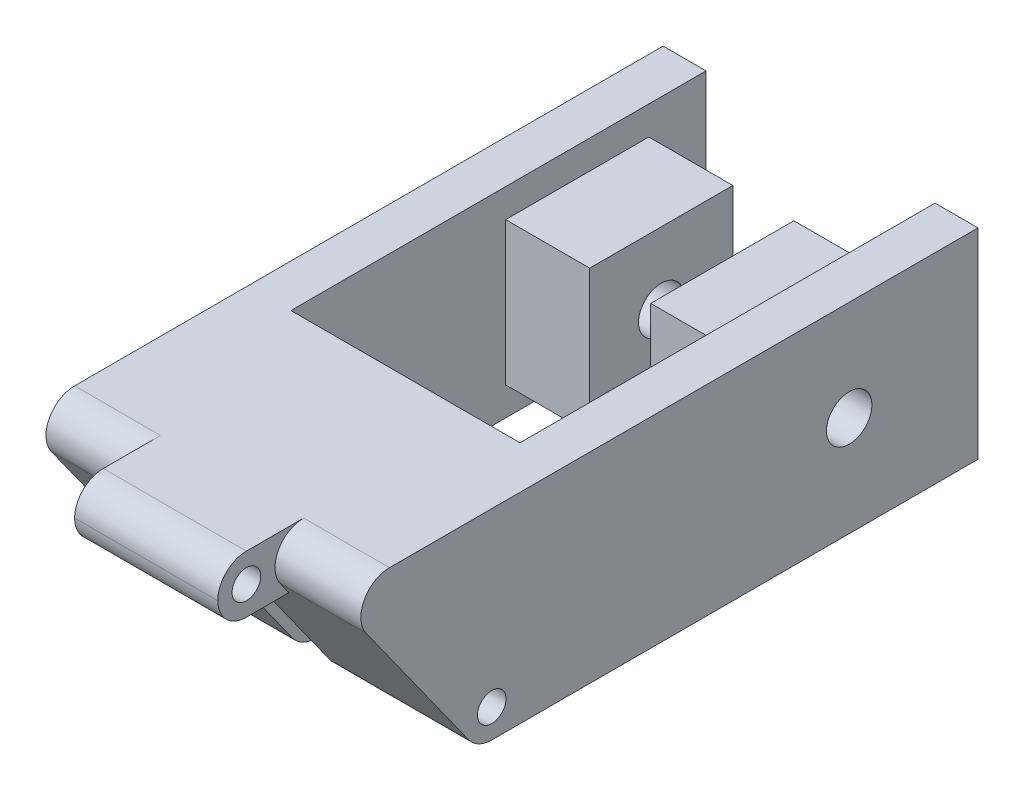
ISO-10303-21;
HEADER;
FILE_DESCRIPTION(('STEP AP214'),'2;1');
FILE_NAME('part.step','',(''),(''),'','','');
FILE_SCHEMA(('AUTOMOTIVE_DESIGN { 1 0 10303 214 1 1 1 1 }'));
ENDSEC;
DATA;
#1=APPLICATION_CONTEXT('core data for automotive mechanical design processes');
#2=APPLICATION_PROTOCOL_DEFINITION('international standard','automotive_design',2000,#1);
#3=PRODUCT_CONTEXT('',#1,'mechanical');
#4=PRODUCT('Part','Part','',(#3));
#5=PRODUCT_RELATED_PRODUCT_CATEGORY('part','',(#4));
#6=PRODUCT_DEFINITION_FORMATION('','',#4);
#7=PRODUCT_DEFINITION_CONTEXT('part definition',#1,'design');
#8=PRODUCT_DEFINITION('design','',#6,#7);
#9=PRODUCT_DEFINITION_SHAPE('','',#8);
#10=(LENGTH_UNIT() NAMED_UNIT(*) SI_UNIT(.MILLI.,.METRE.));
#11=(NAMED_UNIT(*) PLANE_ANGLE_UNIT() SI_UNIT($,.RADIAN.));
#12=(NAMED_UNIT(*) SI_UNIT($,.STERADIAN.) SOLID_ANGLE_UNIT());
#13=UNCERTAINTY_MEASURE_WITH_UNIT(LENGTH_MEASURE(1.E-05),#10,'distance_accuracy_value','');
#14=(GEOMETRIC_REPRESENTATION_CONTEXT(3) GLOBAL_UNCERTAINTY_ASSIGNED_CONTEXT((#13)) GLOBAL_UNIT_ASSIGNED_CONTEXT((#10,
#11,#12)) REPRESENTATION_CONTEXT('',''));
#15=CARTESIAN_POINT('',(0.,0.,0.));
#16=DIRECTION('',(0.,0.,1.));
#17=DIRECTION('',(1.,0.,0.));
#18=AXIS2_PLACEMENT_3D('',#15,#16,#17);
#19=CARTESIAN_POINT('',(8.,0.,0.));
#20=DIRECTION('',(-1.,0.,0.));
#21=DIRECTION('',(0.,0.,1.));
#22=AXIS2_PLACEMENT_3D('',#19,#20,#21);
#23=PLANE('',#22);
#24=DIRECTION('',(0.,0.,-1.));
#25=VECTOR('',#24,1.);
#26=CARTESIAN_POINT('',(8.,6.99999999999999,41.1136213522735));
#27=LINE('',#26,#25);
#28=CARTESIAN_POINT('',(8.,6.99999999999999,29.));
#29=VERTEX_POINT('',#28);
#30=CARTESIAN_POINT('',(8.,6.99999999999999,0.));
#31=VERTEX_POINT('',#30);
#32=EDGE_CURVE('E339',#29,#31,#27,.T.);
#33=ORIENTED_EDGE('',*,*,#32,.T.);
#34=DIRECTION('',(0.,-1.,0.));
#35=VECTOR('',#34,1.);
#36=CARTESIAN_POINT('',(8.,-6.99999999999999,0.));
#37=LINE('',#36,#35);
#38=CARTESIAN_POINT('',(8.,-6.99999999999999,0.));
#39=VERTEX_POINT('',#38);
#40=EDGE_CURVE('E337',#31,#39,#37,.T.);
#41=ORIENTED_EDGE('',*,*,#40,.T.);
#42=DIRECTION('',(0.,0.,1.));
#43=VECTOR('',#42,1.);
#44=CARTESIAN_POINT('',(8.,-7.,33.9707642094164));
#45=LINE('',#44,#43);
#46=CARTESIAN_POINT('',(8.,-7.,29.));
#47=VERTEX_POINT('',#46);
#48=EDGE_CURVE('E12',#39,#47,#45,.T.);
#49=ORIENTED_EDGE('',*,*,#48,.T.);
#50=DIRECTION('',(0.,1.,0.));
#51=VECTOR('',#50,1.);
#52=CARTESIAN_POINT('',(8.,0.,29.));
#53=LINE('',#52,#51);
#54=EDGE_CURVE('E325',#47,#29,#53,.T.);
#55=ORIENTED_EDGE('',*,*,#54,.T.);
#56=EDGE_LOOP('',(#33,#41,#49,#55));
#57=FACE_BOUND('',#56,.T.);
#58=DIRECTION('',(0.,0.,-1.));
#59=VECTOR('',#58,1.);
#60=CARTESIAN_POINT('',(8.,5.,4.));
#61=LINE('',#60,#59);
#62=CARTESIAN_POINT('',(8.,5.,14.));
#63=VERTEX_POINT('',#62);
#64=CARTESIAN_POINT('',(8.,5.,4.));
#65=VERTEX_POINT('',#64);
#66=EDGE_CURVE('E783',#63,#65,#61,.T.);
#67=ORIENTED_EDGE('',*,*,#66,.F.);
#68=DIRECTION('',(0.,1.,0.));
#69=VECTOR('',#68,1.);
#70=CARTESIAN_POINT('',(8.,-5.,14.));
#71=LINE('',#70,#69);
#72=CARTESIAN_POINT('',(8.,-5.,14.));
#73=VERTEX_POINT('',#72);
#74=EDGE_CURVE('E280',#73,#63,#71,.T.);
#75=ORIENTED_EDGE('',*,*,#74,.F.);
#76=DIRECTION('',(0.,0.,1.));
#77=VECTOR('',#76,1.);
#78=CARTESIAN_POINT('',(8.,-5.,4.));
#79=LINE('',#78,#77);
#80=CARTESIAN_POINT('',(8.,-5.,4.));
#81=VERTEX_POINT('',#80);
#82=EDGE_CURVE('E276',#81,#73,#79,.T.);
#83=ORIENTED_EDGE('',*,*,#82,.F.);
#84=DIRECTION('',(0.,-1.,0.));
#85=VECTOR('',#84,1.);
#86=CARTESIAN_POINT('',(8.,-5.,4.));
#87=LINE('',#86,#85);
#88=EDGE_CURVE('E780',#65,#81,#87,.T.);
#89=ORIENTED_EDGE('',*,*,#88,.F.);
#90=EDGE_LOOP('',(#67,#75,#83,#89));
#91=FACE_BOUND('',#90,.T.);
#92=ADVANCED_FACE('F60',(#57,#91),#23,.T.);
#93=CARTESIAN_POINT('',(-8.,0.,0.));
#94=DIRECTION('',(-1.,0.,0.));
#95=DIRECTION('',(0.,0.,1.));
#96=AXIS2_PLACEMENT_3D('',#93,#94,#95);
#97=PLANE('',#96);
#98=DIRECTION('',(0.,1.,0.));
#99=VECTOR('',#98,1.);
#100=CARTESIAN_POINT('',(-8.,0.,29.));
#101=LINE('',#100,#99);
#102=CARTESIAN_POINT('',(-8.,-7.,29.));
#103=VERTEX_POINT('',#102);
#104=CARTESIAN_POINT('',(-8.,6.99999999999999,29.));
#105=VERTEX_POINT('',#104);
#106=EDGE_CURVE('E326',#103,#105,#101,.T.);
#107=ORIENTED_EDGE('',*,*,#106,.F.);
#108=DIRECTION('',(0.,0.,1.));
#109=VECTOR('',#108,1.);
#110=CARTESIAN_POINT('',(-8.,-7.,33.9707642094164));
#111=LINE('',#110,#109);
#112=CARTESIAN_POINT('',(-8.,-6.99999999999999,0.));
#113=VERTEX_POINT('',#112);
#114=EDGE_CURVE('E499',#113,#103,#111,.T.);
#115=ORIENTED_EDGE('',*,*,#114,.F.);
#116=DIRECTION('',(0.,-1.,0.));
#117=VECTOR('',#116,1.);
#118=CARTESIAN_POINT('',(-8.,-6.99999999999999,0.));
#119=LINE('',#118,#117);
#120=CARTESIAN_POINT('',(-8.,6.99999999999999,0.));
#121=VERTEX_POINT('',#120);
#122=EDGE_CURVE('E329',#121,#113,#119,.T.);
#123=ORIENTED_EDGE('',*,*,#122,.F.);
#124=DIRECTION('',(0.,0.,-1.));
#125=VECTOR('',#124,1.);
#126=CARTESIAN_POINT('',(-8.,6.99999999999999,41.1136213522735));
#127=LINE('',#126,#125);
#128=EDGE_CURVE('E334',#105,#121,#127,.T.);
#129=ORIENTED_EDGE('',*,*,#128,.F.);
#130=EDGE_LOOP('',(#107,#115,#123,#129));
#131=FACE_BOUND('',#130,.T.);
#132=DIRECTION('',(0.,1.,0.));
#133=VECTOR('',#132,1.);
#134=CARTESIAN_POINT('',(-8.,-5.,4.));
#135=LINE('',#134,#133);
#136=CARTESIAN_POINT('',(-8.,-5.,4.));
#137=VERTEX_POINT('',#136);
#138=CARTESIAN_POINT('',(-8.,5.,4.));
#139=VERTEX_POINT('',#138);
#140=EDGE_CURVE('E285',#137,#139,#135,.T.);
#141=ORIENTED_EDGE('',*,*,#140,.F.);
#142=DIRECTION('',(0.,0.,-1.));
#143=VECTOR('',#142,1.);
#144=CARTESIAN_POINT('',(-8.,-5.,14.));
#145=LINE('',#144,#143);
#146=CARTESIAN_POINT('',(-8.,-5.,14.));
#147=VERTEX_POINT('',#146);
#148=EDGE_CURVE('E294',#147,#137,#145,.T.);
#149=ORIENTED_EDGE('',*,*,#148,.F.);
#150=DIRECTION('',(0.,-1.,0.));
#151=VECTOR('',#150,1.);
#152=CARTESIAN_POINT('',(-8.,-5.,14.));
#153=LINE('',#152,#151);
#154=CARTESIAN_POINT('',(-8.,5.,14.));
#155=VERTEX_POINT('',#154);
#156=EDGE_CURVE('E304',#155,#147,#153,.T.);
#157=ORIENTED_EDGE('',*,*,#156,.F.);
#158=DIRECTION('',(0.,0.,1.));
#159=VECTOR('',#158,1.);
#160=CARTESIAN_POINT('',(-8.,5.,14.));
#161=LINE('',#160,#159);
#162=EDGE_CURVE('E83',#139,#155,#161,.T.);
#163=ORIENTED_EDGE('',*,*,#162,.F.);
#164=EDGE_LOOP('',(#141,#149,#157,#163));
#165=FACE_BOUND('',#164,.T.);
#166=ADVANCED_FACE('F512',(#131,#165),#97,.F.);
#167=CARTESIAN_POINT('',(11.,-6.99999999999999,0.));
#168=DIRECTION('',(0.,0.,1.));
#169=DIRECTION('',(0.,-1.,0.));
#170=AXIS2_PLACEMENT_3D('',#167,#168,#169);
#171=PLANE('',#170);
#172=ORIENTED_EDGE('',*,*,#40,.F.);
#173=DIRECTION('',(-1.,0.,0.));
#174=VECTOR('',#173,1.);
#175=CARTESIAN_POINT('',(11.,6.99999999999999,0.));
#176=LINE('',#175,#174);
#177=CARTESIAN_POINT('',(11.,6.99999999999999,0.));
#178=VERTEX_POINT('',#177);
#179=EDGE_CURVE('E466',#178,#31,#176,.T.);
#180=ORIENTED_EDGE('',*,*,#179,.F.);
#181=DIRECTION('',(0.,1.,0.));
#182=VECTOR('',#181,1.);
#183=CARTESIAN_POINT('',(11.,-6.99999999999999,0.));
#184=LINE('',#183,#182);
#185=CARTESIAN_POINT('',(11.,-6.99999999999999,0.));
#186=VERTEX_POINT('',#185);
#187=EDGE_CURVE('E415',#186,#178,#184,.T.);
#188=ORIENTED_EDGE('',*,*,#187,.F.);
#189=DIRECTION('',(-1.,0.,0.));
#190=VECTOR('',#189,1.);
#191=CARTESIAN_POINT('',(11.,-6.99999999999999,0.));
#192=LINE('',#191,#190);
#193=EDGE_CURVE('E446',#186,#39,#192,.T.);
#194=ORIENTED_EDGE('',*,*,#193,.T.);
#195=EDGE_LOOP('',(#172,#180,#188,#194));
#196=FACE_BOUND('',#195,.T.);
#197=ADVANCED_FACE('F573',(#196),#171,.F.);
#198=CARTESIAN_POINT('',(11.,6.99999999999999,41.1136213522735));
#199=DIRECTION('',(0.,-1.,0.));
#200=DIRECTION('',(0.,0.,-1.));
#201=AXIS2_PLACEMENT_3D('',#198,#199,#200);
#202=PLANE('',#201);
#203=ORIENTED_EDGE('',*,*,#32,.F.);
#204=DIRECTION('',(1.,0.,0.));
#205=VECTOR('',#204,1.);
#206=CARTESIAN_POINT('',(11.,6.99999999999999,29.));
#207=LINE('',#206,#205);
#208=EDGE_CURVE('E341',#105,#29,#207,.T.);
#209=ORIENTED_EDGE('',*,*,#208,.F.);
#210=ORIENTED_EDGE('',*,*,#128,.T.);
#211=CARTESIAN_POINT('',(-11.,6.99999999999999,0.));
#212=VERTEX_POINT('',#211);
#213=EDGE_CURVE('E465',#121,#212,#176,.T.);
#214=ORIENTED_EDGE('',*,*,#213,.T.);
#215=DIRECTION('',(0.,0.,1.));
#216=VECTOR('',#215,1.);
#217=CARTESIAN_POINT('',(-11.,6.99999999999999,41.1136213522735));
#218=LINE('',#217,#216);
#219=CARTESIAN_POINT('',(-11.,6.99999999999999,41.1136213522735));
#220=VERTEX_POINT('',#219);
#221=EDGE_CURVE('E432',#212,#220,#218,.T.);
#222=ORIENTED_EDGE('',*,*,#221,.T.);
#223=DIRECTION('',(-1.,0.,0.));
#224=VECTOR('',#223,1.);
#225=CARTESIAN_POINT('',(11.,6.99999999999999,41.1136213522735));
#226=LINE('',#225,#224);
#227=CARTESIAN_POINT('',(-5.,6.99999999999999,41.1136213522735));
#228=VERTEX_POINT('',#227);
#229=EDGE_CURVE('E461',#228,#220,#226,.T.);
#230=ORIENTED_EDGE('',*,*,#229,.F.);
#231=DIRECTION('',(0.,0.,1.));
#232=VECTOR('',#231,1.);
#233=CARTESIAN_POINT('',(-5.,6.99999999999999,47.1136213522735));
#234=LINE('',#233,#232);
#235=CARTESIAN_POINT('',(-5.,6.99999999999999,45.1136213522735));
#236=VERTEX_POINT('',#235);
#237=EDGE_CURVE('E391',#228,#236,#234,.T.);
#238=ORIENTED_EDGE('',*,*,#237,.T.);
#239=DIRECTION('',(1.,0.,0.));
#240=VECTOR('',#239,1.);
#241=CARTESIAN_POINT('',(5.,6.99999999999999,45.1136213522735));
#242=LINE('',#241,#240);
#243=CARTESIAN_POINT('',(5.,6.99999999999999,45.1136213522735));
#244=VERTEX_POINT('',#243);
#245=EDGE_CURVE('E488',#236,#244,#242,.T.);
#246=ORIENTED_EDGE('',*,*,#245,.T.);
#247=DIRECTION('',(0.,0.,-1.));
#248=VECTOR('',#247,1.);
#249=CARTESIAN_POINT('',(5.,6.99999999999999,47.1136213522735));
#250=LINE('',#249,#248);
#251=CARTESIAN_POINT('',(5.,6.99999999999999,41.1136213522735));
#252=VERTEX_POINT('',#251);
#253=EDGE_CURVE('E399',#244,#252,#250,.T.);
#254=ORIENTED_EDGE('',*,*,#253,.T.);
#255=CARTESIAN_POINT('',(11.,6.99999999999999,41.1136213522735));
#256=VERTEX_POINT('',#255);
#257=EDGE_CURVE('E462',#256,#252,#226,.T.);
#258=ORIENTED_EDGE('',*,*,#257,.F.);
#259=DIRECTION('',(0.,0.,1.));
#260=VECTOR('',#259,1.);
#261=CARTESIAN_POINT('',(11.,6.99999999999999,41.1136213522735));
#262=LINE('',#261,#260);
#263=EDGE_CURVE('E418',#178,#256,#262,.T.);
#264=ORIENTED_EDGE('',*,*,#263,.F.);
#265=ORIENTED_EDGE('',*,*,#179,.T.);
#266=EDGE_LOOP('',(#203,#209,#210,#214,#222,#230,#238,#246,#254,#258,#264,#265));
#267=FACE_BOUND('',#266,.T.);
#268=ADVANCED_FACE('F520',(#267),#202,.F.);
#269=CARTESIAN_POINT('',(11.,-7.,33.9707642094164));
#270=DIRECTION('',(0.,1.,0.));
#271=DIRECTION('',(0.,0.,1.));
#272=AXIS2_PLACEMENT_3D('',#269,#270,#271);
#273=PLANE('',#272);
#274=ORIENTED_EDGE('',*,*,#48,.F.);
#275=ORIENTED_EDGE('',*,*,#193,.F.);
#276=DIRECTION('',(0.,0.,-1.));
#277=VECTOR('',#276,1.);
#278=CARTESIAN_POINT('',(11.,-7.,33.9707642094164));
#279=LINE('',#278,#277);
#280=CARTESIAN_POINT('',(11.,-7.,33.9707642094164));
#281=VERTEX_POINT('',#280);
#282=EDGE_CURVE('E427',#281,#186,#279,.T.);
#283=ORIENTED_EDGE('',*,*,#282,.F.);
#284=DIRECTION('',(-1.,0.,0.));
#285=VECTOR('',#284,1.);
#286=CARTESIAN_POINT('',(11.,-7.,33.9707642094164));
#287=LINE('',#286,#285);
#288=CARTESIAN_POINT('',(1.3,-7.00000000000007,33.9707642094164));
#289=VERTEX_POINT('',#288);
#290=EDGE_CURVE('E450',#281,#289,#287,.T.);
#291=ORIENTED_EDGE('',*,*,#290,.T.);
#292=DIRECTION('',(0.,0.,1.));
#293=VECTOR('',#292,1.);
#294=CARTESIAN_POINT('',(1.3,-7.00000000000006,31.5982311518299));
#295=LINE('',#294,#293);
#296=CARTESIAN_POINT('',(1.3,-7.00000000000006,31.5982311518299));
#297=VERTEX_POINT('',#296);
#298=EDGE_CURVE('E348',#297,#289,#295,.T.);
#299=ORIENTED_EDGE('',*,*,#298,.F.);
#300=DIRECTION('',(1.,0.,0.));
#301=VECTOR('',#300,1.);
#302=CARTESIAN_POINT('',(1.3,-7.00000000000006,31.5982311518299));
#303=LINE('',#302,#301);
#304=CARTESIAN_POINT('',(-1.3,-7.,31.5982311518299));
#305=VERTEX_POINT('',#304);
#306=EDGE_CURVE('E360',#305,#297,#303,.T.);
#307=ORIENTED_EDGE('',*,*,#306,.F.);
#308=DIRECTION('',(0.,0.,-1.));
#309=VECTOR('',#308,1.);
#310=CARTESIAN_POINT('',(-1.3,-7.00000000000006,31.5982311518299));
#311=LINE('',#310,#309);
#312=CARTESIAN_POINT('',(-1.3,-7.00000000000007,33.9707642094164));
#313=VERTEX_POINT('',#312);
#314=EDGE_CURVE('E343',#313,#305,#311,.T.);
#315=ORIENTED_EDGE('',*,*,#314,.F.);
#316=CARTESIAN_POINT('',(-11.,-7.,33.9707642094164));
#317=VERTEX_POINT('',#316);
#318=EDGE_CURVE('E449',#313,#317,#287,.T.);
#319=ORIENTED_EDGE('',*,*,#318,.T.);
#320=DIRECTION('',(0.,0.,-1.));
#321=VECTOR('',#320,1.);
#322=CARTESIAN_POINT('',(-11.,-7.,33.9707642094164));
#323=LINE('',#322,#321);
#324=CARTESIAN_POINT('',(-11.,-6.99999999999999,0.));
#325=VERTEX_POINT('',#324);
#326=EDGE_CURVE('E419',#317,#325,#323,.T.);
#327=ORIENTED_EDGE('',*,*,#326,.T.);
#328=EDGE_CURVE('E429',#113,#325,#192,.T.);
#329=ORIENTED_EDGE('',*,*,#328,.F.);
#330=ORIENTED_EDGE('',*,*,#114,.T.);
#331=DIRECTION('',(-1.,0.,0.));
#332=VECTOR('',#331,1.);
#333=CARTESIAN_POINT('',(11.,-7.,29.));
#334=LINE('',#333,#332);
#335=EDGE_CURVE('E68',#47,#103,#334,.T.);
#336=ORIENTED_EDGE('',*,*,#335,.F.);
#337=EDGE_LOOP('',(#274,#275,#283,#291,#299,#307,#315,#319,#327,#329,#330,#336));
#338=FACE_BOUND('',#337,.T.);
#339=ADVANCED_FACE('F510',(#338),#273,.F.);
#340=CARTESIAN_POINT('',(11.,-5.00000000000001,33.9707642094164));
#341=DIRECTION('',(-1.,0.,0.));
#342=DIRECTION('',(0.,0.,1.));
#343=AXIS2_PLACEMENT_3D('',#340,#341,#342);
#344=CYLINDRICAL_SURFACE('',#343,2.);
#345=ORIENTED_EDGE('',*,*,#318,.F.);
#346=CARTESIAN_POINT('',(-1.3,-5.00000000000001,33.9707642094164));
#347=DIRECTION('',(-1.,0.,0.));
#348=DIRECTION('',(0.,0.,1.));
#349=AXIS2_PLACEMENT_3D('',#346,#347,#348);
#350=CIRCLE('',#349,2.);
#351=CARTESIAN_POINT('',(-1.3,-6.1624763874382,35.5982311518299));
#352=VERTEX_POINT('',#351);
#353=EDGE_CURVE('E381',#313,#352,#350,.T.);
#354=ORIENTED_EDGE('',*,*,#353,.T.);
#355=DIRECTION('',(-1.,0.,0.));
#356=VECTOR('',#355,1.);
#357=CARTESIAN_POINT('',(11.,-6.1624763874382,35.5982311518299));
#358=LINE('',#357,#356);
#359=CARTESIAN_POINT('',(-11.,-6.1624763874382,35.5982311518299));
#360=VERTEX_POINT('',#359);
#361=EDGE_CURVE('E453',#352,#360,#358,.T.);
#362=ORIENTED_EDGE('',*,*,#361,.T.);
#363=CARTESIAN_POINT('',(-11.,-5.00000000000001,33.9707642094164));
#364=DIRECTION('',(1.,0.,0.));
#365=DIRECTION('',(0.,0.,-1.));
#366=AXIS2_PLACEMENT_3D('',#363,#364,#365);
#367=CIRCLE('',#366,2.);
#368=EDGE_CURVE('E441',#360,#317,#367,.T.);
#369=ORIENTED_EDGE('',*,*,#368,.T.);
#370=EDGE_LOOP('',(#345,#354,#362,#369));
#371=FACE_BOUND('',#370,.T.);
#372=ADVANCED_FACE('F600',(#371),#344,.T.);
#373=CARTESIAN_POINT('',(11.,-5.00000000000001,33.9707642094164));
#374=DIRECTION('',(-1.,0.,0.));
#375=DIRECTION('',(0.,0.,1.));
#376=AXIS2_PLACEMENT_3D('',#373,#374,#375);
#377=CYLINDRICAL_SURFACE('',#376,0.999999999999998);
#378=CARTESIAN_POINT('',(-1.3,-5.00000000000001,33.9707642094164));
#379=DIRECTION('',(-1.,0.,0.));
#380=DIRECTION('',(0.,0.,1.));
#381=AXIS2_PLACEMENT_3D('',#378,#379,#380);
#382=CIRCLE('',#381,0.999999999999998);
#383=CARTESIAN_POINT('',(-1.3,-5.00000000000001,34.9707642094164));
#384=VERTEX_POINT('',#383);
#385=EDGE_CURVE('E380',#384,#384,#382,.T.);
#386=ORIENTED_EDGE('',*,*,#385,.F.);
#387=EDGE_LOOP('',(#386));
#388=FACE_BOUND('',#387,.T.);
#389=CARTESIAN_POINT('',(-11.,-5.00000000000001,33.9707642094164));
#390=DIRECTION('',(1.,0.,0.));
#391=DIRECTION('',(0.,0.,-1.));
#392=AXIS2_PLACEMENT_3D('',#389,#390,#391);
#393=CIRCLE('',#392,0.999999999999998);
#394=CARTESIAN_POINT('',(-11.,-5.00000000000001,32.9707642094164));
#395=VERTEX_POINT('',#394);
#396=EDGE_CURVE('E408',#395,#395,#393,.T.);
#397=ORIENTED_EDGE('',*,*,#396,.F.);
#398=EDGE_LOOP('',(#397));
#399=FACE_BOUND('',#398,.T.);
#400=ADVANCED_FACE('F602',(#388,#399),#377,.F.);
#401=CARTESIAN_POINT('',(11.,4.99999999999999,41.1136213522735));
#402=DIRECTION('',(-1.,0.,0.));
#403=DIRECTION('',(0.,0.,1.));
#404=AXIS2_PLACEMENT_3D('',#401,#402,#403);
#405=CYLINDRICAL_SURFACE('',#404,2.);
#406=DIRECTION('',(-1.,0.,0.));
#407=VECTOR('',#406,1.);
#408=CARTESIAN_POINT('',(11.,3.8375236125618,42.741088294687));
#409=LINE('',#408,#407);
#410=CARTESIAN_POINT('',(-5.,3.8375236125618,42.741088294687));
#411=VERTEX_POINT('',#410);
#412=CARTESIAN_POINT('',(-11.,3.8375236125618,42.741088294687));
#413=VERTEX_POINT('',#412);
#414=EDGE_CURVE('E457',#411,#413,#409,.T.);
#415=ORIENTED_EDGE('',*,*,#414,.F.);
#416=CARTESIAN_POINT('',(-5.,4.99999999999999,41.1136213522735));
#417=DIRECTION('',(-1.,0.,0.));
#418=DIRECTION('',(0.,0.,1.));
#419=AXIS2_PLACEMENT_3D('',#416,#417,#418);
#420=CIRCLE('',#419,2.);
#421=EDGE_CURVE('E406',#411,#228,#420,.T.);
#422=ORIENTED_EDGE('',*,*,#421,.T.);
#423=ORIENTED_EDGE('',*,*,#229,.T.);
#424=CARTESIAN_POINT('',(-11.,4.99999999999999,41.1136213522735));
#425=DIRECTION('',(1.,0.,0.));
#426=DIRECTION('',(0.,0.,1.));
#427=AXIS2_PLACEMENT_3D('',#424,#425,#426);
#428=CIRCLE('',#427,2.);
#429=EDGE_CURVE('E435',#220,#413,#428,.T.);
#430=ORIENTED_EDGE('',*,*,#429,.T.);
#431=EDGE_LOOP('',(#415,#422,#423,#430));
#432=FACE_BOUND('',#431,.T.);
#433=ADVANCED_FACE('F531',(#432),#405,.T.);
#434=CARTESIAN_POINT('',(11.,4.99999999999999,41.1136213522735));
#435=DIRECTION('',(-1.,0.,0.));
#436=DIRECTION('',(0.,0.,1.));
#437=AXIS2_PLACEMENT_3D('',#434,#435,#436);
#438=PLANE('',#437);
#439=CARTESIAN_POINT('',(11.,0.,9.));
#440=DIRECTION('',(-1.,0.,0.));
#441=DIRECTION('',(0.,0.,1.));
#442=AXIS2_PLACEMENT_3D('',#439,#440,#441);
#443=CIRCLE('',#442,1.5875);
#444=CARTESIAN_POINT('',(11.,0.,10.5875));
#445=VERTEX_POINT('',#444);
#446=EDGE_CURVE('E322',#445,#445,#443,.T.);
#447=ORIENTED_EDGE('',*,*,#446,.T.);
#448=EDGE_LOOP('',(#447));
#449=FACE_BOUND('',#448,.T.);
#450=ORIENTED_EDGE('',*,*,#187,.T.);
#451=ORIENTED_EDGE('',*,*,#263,.T.);
#452=CARTESIAN_POINT('',(11.,4.99999999999999,41.1136213522735));
#453=DIRECTION('',(1.,0.,0.));
#454=DIRECTION('',(0.,0.,1.));
#455=AXIS2_PLACEMENT_3D('',#452,#453,#454);
#456=CIRCLE('',#455,2.);
#457=CARTESIAN_POINT('',(11.,3.8375236125618,42.741088294687));
#458=VERTEX_POINT('',#457);
#459=EDGE_CURVE('E421',#256,#458,#456,.T.);
#460=ORIENTED_EDGE('',*,*,#459,.T.);
#461=DIRECTION('',(0.,-0.813733471206735,-0.581238193719097));
#462=VECTOR('',#461,1.);
#463=CARTESIAN_POINT('',(11.,3.8375236125618,42.741088294687));
#464=LINE('',#463,#462);
#465=CARTESIAN_POINT('',(11.,-6.1624763874382,35.5982311518299));
#466=VERTEX_POINT('',#465);
#467=EDGE_CURVE('E423',#458,#466,#464,.T.);
#468=ORIENTED_EDGE('',*,*,#467,.T.);
#469=CARTESIAN_POINT('',(11.,-5.00000000000001,33.9707642094164));
#470=DIRECTION('',(1.,0.,0.));
#471=DIRECTION('',(0.,0.,-1.));
#472=AXIS2_PLACEMENT_3D('',#469,#470,#471);
#473=CIRCLE('',#472,2.);
#474=EDGE_CURVE('E425',#466,#281,#473,.T.);
#475=ORIENTED_EDGE('',*,*,#474,.T.);
#476=ORIENTED_EDGE('',*,*,#282,.T.);
#477=EDGE_LOOP('',(#450,#451,#460,#468,#475,#476));
#478=FACE_BOUND('',#477,.T.);
#479=CARTESIAN_POINT('',(11.,-5.00000000000001,33.9707642094164));
#480=DIRECTION('',(1.,0.,0.));
#481=DIRECTION('',(0.,0.,-1.));
#482=AXIS2_PLACEMENT_3D('',#479,#480,#481);
#483=CIRCLE('',#482,0.999999999999998);
#484=CARTESIAN_POINT('',(11.,-5.00000000000001,32.9707642094164));
#485=VERTEX_POINT('',#484);
#486=EDGE_CURVE('E409',#485,#485,#483,.T.);
#487=ORIENTED_EDGE('',*,*,#486,.F.);
#488=EDGE_LOOP('',(#487));
#489=FACE_BOUND('',#488,.T.);
#490=ADVANCED_FACE('F567',(#449,#478,#489),#438,.F.);
#491=CARTESIAN_POINT('',(-11.,4.99999999999999,41.1136213522735));
#492=DIRECTION('',(-1.,0.,0.));
#493=DIRECTION('',(0.,0.,1.));
#494=AXIS2_PLACEMENT_3D('',#491,#492,#493);
#495=PLANE('',#494);
#496=CARTESIAN_POINT('',(-11.,0.,9.));
#497=DIRECTION('',(-1.,0.,0.));
#498=DIRECTION('',(0.,0.,1.));
#499=AXIS2_PLACEMENT_3D('',#496,#497,#498);
#500=CIRCLE('',#499,1.5875);
#501=CARTESIAN_POINT('',(-11.,0.,10.5875));
#502=VERTEX_POINT('',#501);
#503=EDGE_CURVE('E319',#502,#502,#500,.T.);
#504=ORIENTED_EDGE('',*,*,#503,.F.);
#505=EDGE_LOOP('',(#504));
#506=FACE_BOUND('',#505,.T.);
#507=DIRECTION('',(0.,1.,0.));
#508=VECTOR('',#507,1.);
#509=CARTESIAN_POINT('',(-11.,-6.99999999999999,0.));
#510=LINE('',#509,#508);
#511=EDGE_CURVE('E412',#325,#212,#510,.T.);
#512=ORIENTED_EDGE('',*,*,#511,.F.);
#513=ORIENTED_EDGE('',*,*,#326,.F.);
#514=ORIENTED_EDGE('',*,*,#368,.F.);
#515=DIRECTION('',(0.,-0.813733471206735,-0.581238193719097));
#516=VECTOR('',#515,1.);
#517=CARTESIAN_POINT('',(-11.,3.8375236125618,42.741088294687));
#518=LINE('',#517,#516);
#519=EDGE_CURVE('E438',#413,#360,#518,.T.);
#520=ORIENTED_EDGE('',*,*,#519,.F.);
#521=ORIENTED_EDGE('',*,*,#429,.F.);
#522=ORIENTED_EDGE('',*,*,#221,.F.);
#523=EDGE_LOOP('',(#512,#513,#514,#520,#521,#522));
#524=FACE_BOUND('',#523,.T.);
#525=ORIENTED_EDGE('',*,*,#396,.T.);
#526=EDGE_LOOP('',(#525));
#527=FACE_BOUND('',#526,.T.);
#528=ADVANCED_FACE('F524',(#506,#524,#527),#495,.T.);
#529=ORIENTED_EDGE('',*,*,#213,.F.);
#530=ORIENTED_EDGE('',*,*,#122,.T.);
#531=ORIENTED_EDGE('',*,*,#328,.T.);
#532=ORIENTED_EDGE('',*,*,#511,.T.);
#533=EDGE_LOOP('',(#529,#530,#531,#532));
#534=FACE_BOUND('',#533,.T.);
#535=ADVANCED_FACE('F515',(#534),#171,.F.);
#536=ORIENTED_EDGE('',*,*,#257,.T.);
#537=CARTESIAN_POINT('',(5.,4.99999999999999,41.1136213522735));
#538=DIRECTION('',(1.,0.,0.));
#539=DIRECTION('',(0.,0.,-1.));
#540=AXIS2_PLACEMENT_3D('',#537,#538,#539);
#541=CIRCLE('',#540,2.);
#542=CARTESIAN_POINT('',(5.,3.8375236125618,42.741088294687));
#543=VERTEX_POINT('',#542);
#544=EDGE_CURVE('E401',#252,#543,#541,.T.);
#545=ORIENTED_EDGE('',*,*,#544,.T.);
#546=EDGE_CURVE('E458',#458,#543,#409,.T.);
#547=ORIENTED_EDGE('',*,*,#546,.F.);
#548=ORIENTED_EDGE('',*,*,#459,.F.);
#549=EDGE_LOOP('',(#536,#545,#547,#548));
#550=FACE_BOUND('',#549,.T.);
#551=ADVANCED_FACE('F561',(#550),#405,.T.);
#552=CARTESIAN_POINT('',(11.,3.8375236125618,42.741088294687));
#553=DIRECTION('',(0.,0.581238193719097,-0.813733471206735));
#554=DIRECTION('',(0.,0.813733471206735,0.581238193719097));
#555=AXIS2_PLACEMENT_3D('',#552,#553,#554);
#556=PLANE('',#555);
#557=ORIENTED_EDGE('',*,*,#361,.F.);
#558=DIRECTION('',(0.,0.813733471206735,0.581238193719097));
#559=VECTOR('',#558,1.);
#560=CARTESIAN_POINT('',(-1.3,3.8375236125618,42.741088294687));
#561=LINE('',#560,#559);
#562=CARTESIAN_POINT('',(-1.3,-0.562476387438175,39.5982311518299));
#563=VERTEX_POINT('',#562);
#564=EDGE_CURVE('E384',#352,#563,#561,.T.);
#565=ORIENTED_EDGE('',*,*,#564,.T.);
#566=DIRECTION('',(1.,0.,0.));
#567=VECTOR('',#566,1.);
#568=CARTESIAN_POINT('',(11.,-0.562476387438175,39.5982311518299));
#569=LINE('',#568,#567);
#570=CARTESIAN_POINT('',(1.3,-0.562476387438178,39.5982311518299));
#571=VERTEX_POINT('',#570);
#572=EDGE_CURVE('E490',#563,#571,#569,.T.);
#573=ORIENTED_EDGE('',*,*,#572,.T.);
#574=DIRECTION('',(0.,-0.813733471206735,-0.581238193719097));
#575=VECTOR('',#574,1.);
#576=CARTESIAN_POINT('',(1.3,3.8375236125618,42.741088294687));
#577=LINE('',#576,#575);
#578=CARTESIAN_POINT('',(1.3,-6.1624763874382,35.5982311518299));
#579=VERTEX_POINT('',#578);
#580=EDGE_CURVE('E377',#571,#579,#577,.T.);
#581=ORIENTED_EDGE('',*,*,#580,.T.);
#582=EDGE_CURVE('E454',#466,#579,#358,.T.);
#583=ORIENTED_EDGE('',*,*,#582,.F.);
#584=ORIENTED_EDGE('',*,*,#467,.F.);
#585=ORIENTED_EDGE('',*,*,#546,.T.);
#586=DIRECTION('',(0.,-0.813733471206735,-0.581238193719097));
#587=VECTOR('',#586,1.);
#588=CARTESIAN_POINT('',(5.,3.8375236125618,42.741088294687));
#589=LINE('',#588,#587);
#590=CARTESIAN_POINT('',(5.,2.99999999999999,42.1428571428571));
#591=VERTEX_POINT('',#590);
#592=EDGE_CURVE('E472',#543,#591,#589,.T.);
#593=ORIENTED_EDGE('',*,*,#592,.T.);
#594=DIRECTION('',(1.,0.,0.));
#595=VECTOR('',#594,1.);
#596=CARTESIAN_POINT('',(11.,2.99999999999999,42.1428571428571));
#597=LINE('',#596,#595);
#598=CARTESIAN_POINT('',(-5.,2.99999999999999,42.1428571428571));
#599=VERTEX_POINT('',#598);
#600=EDGE_CURVE('E469',#599,#591,#597,.T.);
#601=ORIENTED_EDGE('',*,*,#600,.F.);
#602=DIRECTION('',(0.,0.813733471206735,0.581238193719097));
#603=VECTOR('',#602,1.);
#604=CARTESIAN_POINT('',(-5.,3.8375236125618,42.741088294687));
#605=LINE('',#604,#603);
#606=EDGE_CURVE('E475',#599,#411,#605,.T.);
#607=ORIENTED_EDGE('',*,*,#606,.T.);
#608=ORIENTED_EDGE('',*,*,#414,.T.);
#609=ORIENTED_EDGE('',*,*,#519,.T.);
#610=EDGE_LOOP('',(#557,#565,#573,#581,#583,#584,#585,#593,#601,#607,#608,#609));
#611=FACE_BOUND('',#610,.T.);
#612=ADVANCED_FACE('F556',(#611),#556,.F.);
#613=ORIENTED_EDGE('',*,*,#582,.T.);
#614=CARTESIAN_POINT('',(1.3,-5.00000000000001,33.9707642094164));
#615=DIRECTION('',(1.,0.,0.));
#616=DIRECTION('',(0.,0.,-1.));
#617=AXIS2_PLACEMENT_3D('',#614,#615,#616);
#618=CIRCLE('',#617,2.);
#619=EDGE_CURVE('E374',#579,#289,#618,.T.);
#620=ORIENTED_EDGE('',*,*,#619,.T.);
#621=ORIENTED_EDGE('',*,*,#290,.F.);
#622=ORIENTED_EDGE('',*,*,#474,.F.);
#623=EDGE_LOOP('',(#613,#620,#621,#622));
#624=FACE_BOUND('',#623,.T.);
#625=ADVANCED_FACE('F581',(#624),#344,.T.);
#626=CARTESIAN_POINT('',(1.3,-5.00000000000001,33.9707642094164));
#627=DIRECTION('',(1.,0.,0.));
#628=DIRECTION('',(0.,0.,-1.));
#629=AXIS2_PLACEMENT_3D('',#626,#627,#628);
#630=CIRCLE('',#629,0.999999999999998);
#631=CARTESIAN_POINT('',(1.3,-5.00000000000001,32.9707642094164));
#632=VERTEX_POINT('',#631);
#633=EDGE_CURVE('E367',#632,#632,#630,.T.);
#634=ORIENTED_EDGE('',*,*,#633,.F.);
#635=EDGE_LOOP('',(#634));
#636=FACE_BOUND('',#635,.T.);
#637=ORIENTED_EDGE('',*,*,#486,.T.);
#638=EDGE_LOOP('',(#637));
#639=FACE_BOUND('',#638,.T.);
#640=ADVANCED_FACE('F610',(#636,#639),#377,.F.);
#641=CARTESIAN_POINT('',(-5.,2.99999999999999,47.1136213522735));
#642=DIRECTION('',(-1.,0.,0.));
#643=DIRECTION('',(0.,0.,1.));
#644=AXIS2_PLACEMENT_3D('',#641,#642,#643);
#645=PLANE('',#644);
#646=CARTESIAN_POINT('',(-5.,4.99999999999999,45.1136213522735));
#647=DIRECTION('',(-1.,0.,0.));
#648=DIRECTION('',(0.,0.,1.));
#649=AXIS2_PLACEMENT_3D('',#646,#647,#648);
#650=CIRCLE('',#649,0.999999999999998);
#651=CARTESIAN_POINT('',(-5.,4.99999999999999,46.1136213522735));
#652=VERTEX_POINT('',#651);
#653=EDGE_CURVE('E392',#652,#652,#650,.F.);
#654=ORIENTED_EDGE('',*,*,#653,.T.);
#655=EDGE_LOOP('',(#654));
#656=FACE_BOUND('',#655,.T.);
#657=DIRECTION('',(0.,0.,1.));
#658=VECTOR('',#657,1.);
#659=CARTESIAN_POINT('',(-5.,2.99999999999999,47.1136213522735));
#660=LINE('',#659,#658);
#661=CARTESIAN_POINT('',(-5.,2.99999999999999,45.1136213522735));
#662=VERTEX_POINT('',#661);
#663=EDGE_CURVE('E395',#599,#662,#660,.T.);
#664=ORIENTED_EDGE('',*,*,#663,.T.);
#665=CARTESIAN_POINT('',(-5.,4.99999999999999,45.1136213522735));
#666=DIRECTION('',(-1.,0.,0.));
#667=DIRECTION('',(0.,0.,1.));
#668=AXIS2_PLACEMENT_3D('',#665,#666,#667);
#669=CIRCLE('',#668,2.);
#670=CARTESIAN_POINT('',(-5.,4.99999999999999,47.1136213522735));
#671=VERTEX_POINT('',#670);
#672=EDGE_CURVE('E486',#662,#671,#669,.T.);
#673=ORIENTED_EDGE('',*,*,#672,.T.);
#674=CARTESIAN_POINT('',(-5.,4.99999999999999,45.1136213522735));
#675=DIRECTION('',(-1.,0.,0.));
#676=DIRECTION('',(0.,0.,1.));
#677=AXIS2_PLACEMENT_3D('',#674,#675,#676);
#678=CIRCLE('',#677,2.);
#679=EDGE_CURVE('E484',#671,#236,#678,.T.);
#680=ORIENTED_EDGE('',*,*,#679,.T.);
#681=ORIENTED_EDGE('',*,*,#237,.F.);
#682=ORIENTED_EDGE('',*,*,#421,.F.);
#683=ORIENTED_EDGE('',*,*,#606,.F.);
#684=EDGE_LOOP('',(#664,#673,#680,#681,#682,#683));
#685=FACE_BOUND('',#684,.T.);
#686=ADVANCED_FACE('F536',(#656,#685),#645,.T.);
#687=CARTESIAN_POINT('',(5.,2.99999999999999,47.1136213522735));
#688=DIRECTION('',(1.,0.,0.));
#689=DIRECTION('',(0.,0.,-1.));
#690=AXIS2_PLACEMENT_3D('',#687,#688,#689);
#691=PLANE('',#690);
#692=CARTESIAN_POINT('',(5.,4.99999999999999,45.1136213522735));
#693=DIRECTION('',(1.,0.,0.));
#694=DIRECTION('',(0.,0.,-1.));
#695=AXIS2_PLACEMENT_3D('',#692,#693,#694);
#696=CIRCLE('',#695,0.999999999999998);
#697=CARTESIAN_POINT('',(5.,4.99999999999999,44.1136213522735));
#698=VERTEX_POINT('',#697);
#699=EDGE_CURVE('E388',#698,#698,#696,.T.);
#700=ORIENTED_EDGE('',*,*,#699,.F.);
#701=EDGE_LOOP('',(#700));
#702=FACE_BOUND('',#701,.T.);
#703=CARTESIAN_POINT('',(5.,4.99999999999999,45.1136213522735));
#704=DIRECTION('',(1.,0.,0.));
#705=DIRECTION('',(0.,0.,-1.));
#706=AXIS2_PLACEMENT_3D('',#703,#704,#705);
#707=CIRCLE('',#706,2.);
#708=CARTESIAN_POINT('',(5.,4.99999999999999,47.1136213522735));
#709=VERTEX_POINT('',#708);
#710=EDGE_CURVE('E477',#244,#709,#707,.T.);
#711=ORIENTED_EDGE('',*,*,#710,.T.);
#712=CARTESIAN_POINT('',(5.,4.99999999999999,45.1136213522735));
#713=DIRECTION('',(1.,0.,0.));
#714=DIRECTION('',(0.,0.,-1.));
#715=AXIS2_PLACEMENT_3D('',#712,#713,#714);
#716=CIRCLE('',#715,2.);
#717=CARTESIAN_POINT('',(5.,2.99999999999999,45.1136213522735));
#718=VERTEX_POINT('',#717);
#719=EDGE_CURVE('E479',#709,#718,#716,.T.);
#720=ORIENTED_EDGE('',*,*,#719,.T.);
#721=DIRECTION('',(0.,0.,-1.));
#722=VECTOR('',#721,1.);
#723=CARTESIAN_POINT('',(5.,2.99999999999999,47.1136213522735));
#724=LINE('',#723,#722);
#725=EDGE_CURVE('E398',#718,#591,#724,.T.);
#726=ORIENTED_EDGE('',*,*,#725,.T.);
#727=ORIENTED_EDGE('',*,*,#592,.F.);
#728=ORIENTED_EDGE('',*,*,#544,.F.);
#729=ORIENTED_EDGE('',*,*,#253,.F.);
#730=EDGE_LOOP('',(#711,#720,#726,#727,#728,#729));
#731=FACE_BOUND('',#730,.T.);
#732=ADVANCED_FACE('F548',(#702,#731),#691,.T.);
#733=CARTESIAN_POINT('',(0.,2.99999999999999,0.));
#734=DIRECTION('',(0.,1.,0.));
#735=DIRECTION('',(0.,0.,1.));
#736=AXIS2_PLACEMENT_3D('',#733,#734,#735);
#737=PLANE('',#736);
#738=ORIENTED_EDGE('',*,*,#725,.F.);
#739=DIRECTION('',(1.,0.,0.));
#740=VECTOR('',#739,1.);
#741=CARTESIAN_POINT('',(-5.,2.99999999999999,45.1136213522735));
#742=LINE('',#741,#740);
#743=EDGE_CURVE('E481',#718,#662,#742,.F.);
#744=ORIENTED_EDGE('',*,*,#743,.T.);
#745=ORIENTED_EDGE('',*,*,#663,.F.);
#746=ORIENTED_EDGE('',*,*,#600,.T.);
#747=EDGE_LOOP('',(#738,#744,#745,#746));
#748=FACE_BOUND('',#747,.T.);
#749=ADVANCED_FACE('F552',(#748),#737,.F.);
#750=CARTESIAN_POINT('',(-11.001,4.99999999999999,45.1136213522735));
#751=DIRECTION('',(1.,0.,0.));
#752=DIRECTION('',(0.,0.,-1.));
#753=AXIS2_PLACEMENT_3D('',#750,#751,#752);
#754=CYLINDRICAL_SURFACE('',#753,0.999999999999998);
#755=ORIENTED_EDGE('',*,*,#653,.F.);
#756=EDGE_LOOP('',(#755));
#757=FACE_BOUND('',#756,.T.);
#758=ORIENTED_EDGE('',*,*,#699,.T.);
#759=EDGE_LOOP('',(#758));
#760=FACE_BOUND('',#759,.T.);
#761=ADVANCED_FACE('F640',(#757,#760),#754,.F.);
#762=CARTESIAN_POINT('',(11.,4.99999999999999,45.1136213522735));
#763=DIRECTION('',(-1.,0.,0.));
#764=DIRECTION('',(0.,0.,1.));
#765=AXIS2_PLACEMENT_3D('',#762,#763,#764);
#766=CYLINDRICAL_SURFACE('',#765,2.);
#767=ORIENTED_EDGE('',*,*,#245,.F.);
#768=ORIENTED_EDGE('',*,*,#679,.F.);
#769=DIRECTION('',(1.,0.,0.));
#770=VECTOR('',#769,1.);
#771=CARTESIAN_POINT('',(-5.,4.99999999999999,47.1136213522735));
#772=LINE('',#771,#770);
#773=EDGE_CURVE('E387',#709,#671,#772,.F.);
#774=ORIENTED_EDGE('',*,*,#773,.F.);
#775=ORIENTED_EDGE('',*,*,#710,.F.);
#776=EDGE_LOOP('',(#767,#768,#774,#775));
#777=FACE_BOUND('',#776,.T.);
#778=ADVANCED_FACE('F62',(#777),#766,.T.);
#779=CARTESIAN_POINT('',(5.,4.99999999999999,45.1136213522735));
#780=DIRECTION('',(-1.,0.,0.));
#781=DIRECTION('',(0.,0.,1.));
#782=AXIS2_PLACEMENT_3D('',#779,#780,#781);
#783=CYLINDRICAL_SURFACE('',#782,2.);
#784=ORIENTED_EDGE('',*,*,#672,.F.);
#785=ORIENTED_EDGE('',*,*,#743,.F.);
#786=ORIENTED_EDGE('',*,*,#719,.F.);
#787=ORIENTED_EDGE('',*,*,#773,.T.);
#788=EDGE_LOOP('',(#784,#785,#786,#787));
#789=FACE_BOUND('',#788,.T.);
#790=ADVANCED_FACE('F544',(#789),#783,.T.);
#791=CARTESIAN_POINT('',(1.3,0.,39.5982311518299));
#792=DIRECTION('',(0.,0.,1.));
#793=DIRECTION('',(0.,-1.,0.));
#794=AXIS2_PLACEMENT_3D('',#791,#792,#793);
#795=PLANE('',#794);
#796=DIRECTION('',(0.,-1.,0.));
#797=VECTOR('',#796,1.);
#798=CARTESIAN_POINT('',(-1.3,0.,39.5982311518299));
#799=LINE('',#798,#797);
#800=CARTESIAN_POINT('',(-1.3,0.,39.5982311518299));
#801=VERTEX_POINT('',#800);
#802=EDGE_CURVE('E364',#801,#563,#799,.T.);
#803=ORIENTED_EDGE('',*,*,#802,.F.);
#804=DIRECTION('',(-1.,0.,0.));
#805=VECTOR('',#804,1.);
#806=CARTESIAN_POINT('',(1.3,0.,39.5982311518299));
#807=LINE('',#806,#805);
#808=CARTESIAN_POINT('',(1.3,0.,39.5982311518299));
#809=VERTEX_POINT('',#808);
#810=EDGE_CURVE('E354',#809,#801,#807,.T.);
#811=ORIENTED_EDGE('',*,*,#810,.F.);
#812=DIRECTION('',(0.,-1.,0.));
#813=VECTOR('',#812,1.);
#814=CARTESIAN_POINT('',(1.3,0.,39.5982311518299));
#815=LINE('',#814,#813);
#816=EDGE_CURVE('E368',#809,#571,#815,.T.);
#817=ORIENTED_EDGE('',*,*,#816,.T.);
#818=ORIENTED_EDGE('',*,*,#572,.F.);
#819=EDGE_LOOP('',(#803,#811,#817,#818));
#820=FACE_BOUND('',#819,.T.);
#821=ADVANCED_FACE('F586',(#820),#795,.F.);
#822=CARTESIAN_POINT('',(-1.3,0.,31.5982311518299));
#823=DIRECTION('',(-1.,0.,0.));
#824=DIRECTION('',(0.,0.,1.));
#825=AXIS2_PLACEMENT_3D('',#822,#823,#824);
#826=PLANE('',#825);
#827=ORIENTED_EDGE('',*,*,#385,.T.);
#828=EDGE_LOOP('',(#827));
#829=FACE_BOUND('',#828,.T.);
#830=ORIENTED_EDGE('',*,*,#353,.F.);
#831=ORIENTED_EDGE('',*,*,#314,.T.);
#832=DIRECTION('',(0.,-1.,0.));
#833=VECTOR('',#832,1.);
#834=CARTESIAN_POINT('',(-1.3,0.,31.5982311518299));
#835=LINE('',#834,#833);
#836=CARTESIAN_POINT('',(-1.3,0.,31.5982311518299));
#837=VERTEX_POINT('',#836);
#838=EDGE_CURVE('E357',#837,#305,#835,.T.);
#839=ORIENTED_EDGE('',*,*,#838,.F.);
#840=DIRECTION('',(0.,0.,-1.));
#841=VECTOR('',#840,1.);
#842=CARTESIAN_POINT('',(-1.3,0.,31.5982311518299));
#843=LINE('',#842,#841);
#844=EDGE_CURVE('E344',#801,#837,#843,.T.);
#845=ORIENTED_EDGE('',*,*,#844,.F.);
#846=ORIENTED_EDGE('',*,*,#802,.T.);
#847=ORIENTED_EDGE('',*,*,#564,.F.);
#848=EDGE_LOOP('',(#830,#831,#839,#845,#846,#847));
#849=FACE_BOUND('',#848,.T.);
#850=ADVANCED_FACE('F590',(#829,#849),#826,.F.);
#851=CARTESIAN_POINT('',(1.3,0.,31.5982311518299));
#852=DIRECTION('',(1.,0.,0.));
#853=DIRECTION('',(0.,0.,-1.));
#854=AXIS2_PLACEMENT_3D('',#851,#852,#853);
#855=PLANE('',#854);
#856=ORIENTED_EDGE('',*,*,#633,.T.);
#857=EDGE_LOOP('',(#856));
#858=FACE_BOUND('',#857,.T.);
#859=ORIENTED_EDGE('',*,*,#816,.F.);
#860=DIRECTION('',(0.,0.,1.));
#861=VECTOR('',#860,1.);
#862=CARTESIAN_POINT('',(1.3,0.,31.5982311518299));
#863=LINE('',#862,#861);
#864=CARTESIAN_POINT('',(1.3,0.,31.5982311518299));
#865=VERTEX_POINT('',#864);
#866=EDGE_CURVE('E351',#865,#809,#863,.T.);
#867=ORIENTED_EDGE('',*,*,#866,.F.);
#868=DIRECTION('',(0.,-1.,0.));
#869=VECTOR('',#868,1.);
#870=CARTESIAN_POINT('',(1.3,0.,31.5982311518299));
#871=LINE('',#870,#869);
#872=EDGE_CURVE('E371',#865,#297,#871,.T.);
#873=ORIENTED_EDGE('',*,*,#872,.T.);
#874=ORIENTED_EDGE('',*,*,#298,.T.);
#875=ORIENTED_EDGE('',*,*,#619,.F.);
#876=ORIENTED_EDGE('',*,*,#580,.F.);
#877=EDGE_LOOP('',(#859,#867,#873,#874,#875,#876));
#878=FACE_BOUND('',#877,.T.);
#879=ADVANCED_FACE('F584',(#858,#878),#855,.F.);
#880=CARTESIAN_POINT('',(1.3,0.,31.5982311518299));
#881=DIRECTION('',(0.,0.,-1.));
#882=DIRECTION('',(0.,1.,0.));
#883=AXIS2_PLACEMENT_3D('',#880,#881,#882);
#884=PLANE('',#883);
#885=ORIENTED_EDGE('',*,*,#306,.T.);
#886=ORIENTED_EDGE('',*,*,#872,.F.);
#887=DIRECTION('',(1.,0.,0.));
#888=VECTOR('',#887,1.);
#889=CARTESIAN_POINT('',(1.3,0.,31.5982311518299));
#890=LINE('',#889,#888);
#891=EDGE_CURVE('E347',#837,#865,#890,.T.);
#892=ORIENTED_EDGE('',*,*,#891,.F.);
#893=ORIENTED_EDGE('',*,*,#838,.T.);
#894=EDGE_LOOP('',(#885,#886,#892,#893));
#895=FACE_BOUND('',#894,.T.);
#896=ADVANCED_FACE('F596',(#895),#884,.F.);
#897=CARTESIAN_POINT('',(0.,0.,0.));
#898=DIRECTION('',(0.,-1.,0.));
#899=DIRECTION('',(0.,0.,-1.));
#900=AXIS2_PLACEMENT_3D('',#897,#898,#899);
#901=PLANE('',#900);
#902=ORIENTED_EDGE('',*,*,#844,.T.);
#903=ORIENTED_EDGE('',*,*,#891,.T.);
#904=ORIENTED_EDGE('',*,*,#866,.T.);
#905=ORIENTED_EDGE('',*,*,#810,.T.);
#906=EDGE_LOOP('',(#902,#903,#904,#905));
#907=FACE_BOUND('',#906,.T.);
#908=ADVANCED_FACE('F593',(#907),#901,.T.);
#909=CARTESIAN_POINT('',(-8.,0.,29.));
#910=DIRECTION('',(0.,0.,-1.));
#911=DIRECTION('',(-1.,0.,0.));
#912=AXIS2_PLACEMENT_3D('',#909,#910,#911);
#913=PLANE('',#912);
#914=ORIENTED_EDGE('',*,*,#208,.T.);
#915=ORIENTED_EDGE('',*,*,#54,.F.);
#916=ORIENTED_EDGE('',*,*,#335,.T.);
#917=ORIENTED_EDGE('',*,*,#106,.T.);
#918=EDGE_LOOP('',(#914,#915,#916,#917));
#919=FACE_BOUND('',#918,.T.);
#920=ADVANCED_FACE('F505',(#919),#913,.T.);
#921=CARTESIAN_POINT('',(12.5,0.,9.));
#922=DIRECTION('',(-1.,0.,0.));
#923=DIRECTION('',(0.,0.,1.));
#924=AXIS2_PLACEMENT_3D('',#921,#922,#923);
#925=CYLINDRICAL_SURFACE('',#924,1.5875);
#926=ORIENTED_EDGE('',*,*,#503,.T.);
#927=EDGE_LOOP('',(#926));
#928=FACE_BOUND('',#927,.T.);
#929=CARTESIAN_POINT('',(-2.13,0.,9.));
#930=DIRECTION('',(1.,0.,0.));
#931=DIRECTION('',(0.,0.,-1.));
#932=AXIS2_PLACEMENT_3D('',#929,#930,#931);
#933=CIRCLE('',#932,1.5875);
#934=CARTESIAN_POINT('',(-2.13,0.,7.4125));
#935=VERTEX_POINT('',#934);
#936=EDGE_CURVE('E282',#935,#935,#933,.T.);
#937=ORIENTED_EDGE('',*,*,#936,.T.);
#938=EDGE_LOOP('',(#937));
#939=FACE_BOUND('',#938,.T.);
#940=ADVANCED_FACE('F627',(#928,#939),#925,.F.);
#941=ORIENTED_EDGE('',*,*,#446,.F.);
#942=EDGE_LOOP('',(#941));
#943=FACE_BOUND('',#942,.T.);
#944=CARTESIAN_POINT('',(2.135,0.,9.));
#945=DIRECTION('',(-1.,0.,0.));
#946=DIRECTION('',(0.,0.,1.));
#947=AXIS2_PLACEMENT_3D('',#944,#945,#946);
#948=CIRCLE('',#947,1.5875);
#949=CARTESIAN_POINT('',(2.135,0.,10.5875));
#950=VERTEX_POINT('',#949);
#951=EDGE_CURVE('E784',#950,#950,#948,.T.);
#952=ORIENTED_EDGE('',*,*,#951,.T.);
#953=EDGE_LOOP('',(#952));
#954=FACE_BOUND('',#953,.T.);
#955=ADVANCED_FACE('F667',(#943,#954),#925,.F.);
#956=CARTESIAN_POINT('',(-2.13,0.,0.));
#957=DIRECTION('',(-1.,0.,0.));
#958=DIRECTION('',(0.,0.,1.));
#959=AXIS2_PLACEMENT_3D('',#956,#957,#958);
#960=PLANE('',#959);
#961=DIRECTION('',(0.,1.,0.));
#962=VECTOR('',#961,1.);
#963=CARTESIAN_POINT('',(-2.13,-5.,4.));
#964=LINE('',#963,#962);
#965=CARTESIAN_POINT('',(-2.13,-5.,4.));
#966=VERTEX_POINT('',#965);
#967=CARTESIAN_POINT('',(-2.13,5.,4.));
#968=VERTEX_POINT('',#967);
#969=EDGE_CURVE('E290',#966,#968,#964,.T.);
#970=ORIENTED_EDGE('',*,*,#969,.T.);
#971=DIRECTION('',(0.,0.,1.));
#972=VECTOR('',#971,1.);
#973=CARTESIAN_POINT('',(-2.13,5.,14.));
#974=LINE('',#973,#972);
#975=CARTESIAN_POINT('',(-2.13,5.,14.));
#976=VERTEX_POINT('',#975);
#977=EDGE_CURVE('E293',#968,#976,#974,.T.);
#978=ORIENTED_EDGE('',*,*,#977,.T.);
#979=DIRECTION('',(0.,-1.,0.));
#980=VECTOR('',#979,1.);
#981=CARTESIAN_POINT('',(-2.13,-5.,14.));
#982=LINE('',#981,#980);
#983=CARTESIAN_POINT('',(-2.13,-5.,14.));
#984=VERTEX_POINT('',#983);
#985=EDGE_CURVE('E296',#976,#984,#982,.T.);
#986=ORIENTED_EDGE('',*,*,#985,.T.);
#987=DIRECTION('',(0.,0.,-1.));
#988=VECTOR('',#987,1.);
#989=CARTESIAN_POINT('',(-2.13,-5.,14.));
#990=LINE('',#989,#988);
#991=EDGE_CURVE('E298',#984,#966,#990,.T.);
#992=ORIENTED_EDGE('',*,*,#991,.T.);
#993=EDGE_LOOP('',(#970,#978,#986,#992));
#994=FACE_BOUND('',#993,.T.);
#995=ORIENTED_EDGE('',*,*,#936,.F.);
#996=EDGE_LOOP('',(#995));
#997=FACE_BOUND('',#996,.T.);
#998=ADVANCED_FACE('F670',(#994,#997),#960,.F.);
#999=CARTESIAN_POINT('',(-2.13,-5.,4.));
#1000=DIRECTION('',(0.,0.,1.));
#1001=DIRECTION('',(1.,0.,0.));
#1002=AXIS2_PLACEMENT_3D('',#999,#1000,#1001);
#1003=PLANE('',#1002);
#1004=ORIENTED_EDGE('',*,*,#140,.T.);
#1005=DIRECTION('',(-1.,0.,0.));
#1006=VECTOR('',#1005,1.);
#1007=CARTESIAN_POINT('',(-2.13,5.,4.));
#1008=LINE('',#1007,#1006);
#1009=EDGE_CURVE('E317',#968,#139,#1008,.T.);
#1010=ORIENTED_EDGE('',*,*,#1009,.F.);
#1011=ORIENTED_EDGE('',*,*,#969,.F.);
#1012=DIRECTION('',(-1.,0.,0.));
#1013=VECTOR('',#1012,1.);
#1014=CARTESIAN_POINT('',(-2.13,-5.,4.));
#1015=LINE('',#1014,#1013);
#1016=EDGE_CURVE('E300',#966,#137,#1015,.T.);
#1017=ORIENTED_EDGE('',*,*,#1016,.T.);
#1018=EDGE_LOOP('',(#1004,#1010,#1011,#1017));
#1019=FACE_BOUND('',#1018,.T.);
#1020=ADVANCED_FACE('F672',(#1019),#1003,.F.);
#1021=CARTESIAN_POINT('',(-2.13,5.,14.));
#1022=DIRECTION('',(0.,-1.,0.));
#1023=DIRECTION('',(0.,0.,-1.));
#1024=AXIS2_PLACEMENT_3D('',#1021,#1022,#1023);
#1025=PLANE('',#1024);
#1026=ORIENTED_EDGE('',*,*,#162,.T.);
#1027=DIRECTION('',(-1.,0.,0.));
#1028=VECTOR('',#1027,1.);
#1029=CARTESIAN_POINT('',(-2.13,5.,14.));
#1030=LINE('',#1029,#1028);
#1031=EDGE_CURVE('E314',#976,#155,#1030,.T.);
#1032=ORIENTED_EDGE('',*,*,#1031,.F.);
#1033=ORIENTED_EDGE('',*,*,#977,.F.);
#1034=ORIENTED_EDGE('',*,*,#1009,.T.);
#1035=EDGE_LOOP('',(#1026,#1032,#1033,#1034));
#1036=FACE_BOUND('',#1035,.T.);
#1037=ADVANCED_FACE('F678',(#1036),#1025,.F.);
#1038=CARTESIAN_POINT('',(-2.13,-5.,14.));
#1039=DIRECTION('',(0.,0.,-1.));
#1040=DIRECTION('',(-1.,0.,0.));
#1041=AXIS2_PLACEMENT_3D('',#1038,#1039,#1040);
#1042=PLANE('',#1041);
#1043=ORIENTED_EDGE('',*,*,#156,.T.);
#1044=DIRECTION('',(-1.,0.,0.));
#1045=VECTOR('',#1044,1.);
#1046=CARTESIAN_POINT('',(-2.13,-5.,14.));
#1047=LINE('',#1046,#1045);
#1048=EDGE_CURVE('E311',#984,#147,#1047,.T.);
#1049=ORIENTED_EDGE('',*,*,#1048,.F.);
#1050=ORIENTED_EDGE('',*,*,#985,.F.);
#1051=ORIENTED_EDGE('',*,*,#1031,.T.);
#1052=EDGE_LOOP('',(#1043,#1049,#1050,#1051));
#1053=FACE_BOUND('',#1052,.T.);
#1054=ADVANCED_FACE('F687',(#1053),#1042,.F.);
#1055=CARTESIAN_POINT('',(-2.13,-5.,14.));
#1056=DIRECTION('',(0.,1.,0.));
#1057=DIRECTION('',(0.,0.,1.));
#1058=AXIS2_PLACEMENT_3D('',#1055,#1056,#1057);
#1059=PLANE('',#1058);
#1060=ORIENTED_EDGE('',*,*,#148,.T.);
#1061=ORIENTED_EDGE('',*,*,#1016,.F.);
#1062=ORIENTED_EDGE('',*,*,#991,.F.);
#1063=ORIENTED_EDGE('',*,*,#1048,.T.);
#1064=EDGE_LOOP('',(#1060,#1061,#1062,#1063));
#1065=FACE_BOUND('',#1064,.T.);
#1066=ADVANCED_FACE('F685',(#1065),#1059,.F.);
#1067=CARTESIAN_POINT('',(2.135,0.,0.));
#1068=DIRECTION('',(1.,0.,0.));
#1069=DIRECTION('',(0.,0.,-1.));
#1070=AXIS2_PLACEMENT_3D('',#1067,#1068,#1069);
#1071=PLANE('',#1070);
#1072=DIRECTION('',(0.,1.,0.));
#1073=VECTOR('',#1072,1.);
#1074=CARTESIAN_POINT('',(2.135,-5.,14.));
#1075=LINE('',#1074,#1073);
#1076=CARTESIAN_POINT('',(2.135,-5.,14.));
#1077=VERTEX_POINT('',#1076);
#1078=CARTESIAN_POINT('',(2.135,5.,14.));
#1079=VERTEX_POINT('',#1078);
#1080=EDGE_CURVE('E267',#1077,#1079,#1075,.T.);
#1081=ORIENTED_EDGE('',*,*,#1080,.T.);
#1082=DIRECTION('',(0.,0.,-1.));
#1083=VECTOR('',#1082,1.);
#1084=CARTESIAN_POINT('',(2.135,5.,4.));
#1085=LINE('',#1084,#1083);
#1086=CARTESIAN_POINT('',(2.135,5.,4.));
#1087=VERTEX_POINT('',#1086);
#1088=EDGE_CURVE('E256',#1079,#1087,#1085,.T.);
#1089=ORIENTED_EDGE('',*,*,#1088,.T.);
#1090=DIRECTION('',(0.,-1.,0.));
#1091=VECTOR('',#1090,1.);
#1092=CARTESIAN_POINT('',(2.135,-5.,4.));
#1093=LINE('',#1092,#1091);
#1094=CARTESIAN_POINT('',(2.135,-5.,4.));
#1095=VERTEX_POINT('',#1094);
#1096=EDGE_CURVE('E266',#1087,#1095,#1093,.T.);
#1097=ORIENTED_EDGE('',*,*,#1096,.T.);
#1098=DIRECTION('',(0.,0.,1.));
#1099=VECTOR('',#1098,1.);
#1100=CARTESIAN_POINT('',(2.135,-5.,4.));
#1101=LINE('',#1100,#1099);
#1102=EDGE_CURVE('E272',#1095,#1077,#1101,.T.);
#1103=ORIENTED_EDGE('',*,*,#1102,.T.);
#1104=EDGE_LOOP('',(#1081,#1089,#1097,#1103));
#1105=FACE_BOUND('',#1104,.T.);
#1106=ORIENTED_EDGE('',*,*,#951,.F.);
#1107=EDGE_LOOP('',(#1106));
#1108=FACE_BOUND('',#1107,.T.);
#1109=ADVANCED_FACE('F270',(#1105,#1108),#1071,.F.);
#1110=CARTESIAN_POINT('',(2.135,-5.,14.));
#1111=DIRECTION('',(0.,0.,-1.));
#1112=DIRECTION('',(-1.,0.,0.));
#1113=AXIS2_PLACEMENT_3D('',#1110,#1111,#1112);
#1114=PLANE('',#1113);
#1115=ORIENTED_EDGE('',*,*,#74,.T.);
#1116=DIRECTION('',(1.,0.,0.));
#1117=VECTOR('',#1116,1.);
#1118=CARTESIAN_POINT('',(2.135,5.,14.));
#1119=LINE('',#1118,#1117);
#1120=EDGE_CURVE('E260',#1079,#63,#1119,.T.);
#1121=ORIENTED_EDGE('',*,*,#1120,.F.);
#1122=ORIENTED_EDGE('',*,*,#1080,.F.);
#1123=DIRECTION('',(1.,0.,0.));
#1124=VECTOR('',#1123,1.);
#1125=CARTESIAN_POINT('',(2.135,-5.,14.));
#1126=LINE('',#1125,#1124);
#1127=EDGE_CURVE('E778',#1077,#73,#1126,.T.);
#1128=ORIENTED_EDGE('',*,*,#1127,.T.);
#1129=EDGE_LOOP('',(#1115,#1121,#1122,#1128));
#1130=FACE_BOUND('',#1129,.T.);
#1131=ADVANCED_FACE('F278',(#1130),#1114,.F.);
#1132=CARTESIAN_POINT('',(2.135,5.,4.));
#1133=DIRECTION('',(0.,-1.,0.));
#1134=DIRECTION('',(0.,0.,-1.));
#1135=AXIS2_PLACEMENT_3D('',#1132,#1133,#1134);
#1136=PLANE('',#1135);
#1137=ORIENTED_EDGE('',*,*,#66,.T.);
#1138=DIRECTION('',(1.,0.,0.));
#1139=VECTOR('',#1138,1.);
#1140=CARTESIAN_POINT('',(2.135,5.,4.));
#1141=LINE('',#1140,#1139);
#1142=EDGE_CURVE('E263',#1087,#65,#1141,.T.);
#1143=ORIENTED_EDGE('',*,*,#1142,.F.);
#1144=ORIENTED_EDGE('',*,*,#1088,.F.);
#1145=ORIENTED_EDGE('',*,*,#1120,.T.);
#1146=EDGE_LOOP('',(#1137,#1143,#1144,#1145));
#1147=FACE_BOUND('',#1146,.T.);
#1148=ADVANCED_FACE('F258',(#1147),#1136,.F.);
#1149=CARTESIAN_POINT('',(2.135,-5.,4.));
#1150=DIRECTION('',(0.,0.,1.));
#1151=DIRECTION('',(1.,0.,0.));
#1152=AXIS2_PLACEMENT_3D('',#1149,#1150,#1151);
#1153=PLANE('',#1152);
#1154=ORIENTED_EDGE('',*,*,#88,.T.);
#1155=DIRECTION('',(1.,0.,0.));
#1156=VECTOR('',#1155,1.);
#1157=CARTESIAN_POINT('',(2.135,-5.,4.));
#1158=LINE('',#1157,#1156);
#1159=EDGE_CURVE('E75',#1095,#81,#1158,.T.);
#1160=ORIENTED_EDGE('',*,*,#1159,.F.);
#1161=ORIENTED_EDGE('',*,*,#1096,.F.);
#1162=ORIENTED_EDGE('',*,*,#1142,.T.);
#1163=EDGE_LOOP('',(#1154,#1160,#1161,#1162));
#1164=FACE_BOUND('',#1163,.T.);
#1165=ADVANCED_FACE('F757',(#1164),#1153,.F.);
#1166=CARTESIAN_POINT('',(2.135,-5.,4.));
#1167=DIRECTION('',(0.,1.,0.));
#1168=DIRECTION('',(0.,0.,1.));
#1169=AXIS2_PLACEMENT_3D('',#1166,#1167,#1168);
#1170=PLANE('',#1169);
#1171=ORIENTED_EDGE('',*,*,#82,.T.);
#1172=ORIENTED_EDGE('',*,*,#1127,.F.);
#1173=ORIENTED_EDGE('',*,*,#1102,.F.);
#1174=ORIENTED_EDGE('',*,*,#1159,.T.);
#1175=EDGE_LOOP('',(#1171,#1172,#1173,#1174));
#1176=FACE_BOUND('',#1175,.T.);
#1177=ADVANCED_FACE('F765',(#1176),#1170,.F.);
#1178=CLOSED_SHELL('',(#92,#166,#197,#268,#339,#372,#400,#433,#490,#528,#535,#551,#612,#625,
#640,#686,#732,#749,#761,#778,#790,#821,#850,#879,#896,#908,#920,#940,#955,#998,#1020,#1037,
#1054,#1066,#1109,#1131,#1148,#1165,#1177));
#1179=MANIFOLD_SOLID_BREP('B2',#1178);
#1180=ADVANCED_BREP_SHAPE_REPRESENTATION('',(#18,#1179),#14);
#1181=SHAPE_DEFINITION_REPRESENTATION(#9,#1180);
ENDSEC;
END-ISO-10303-21;
